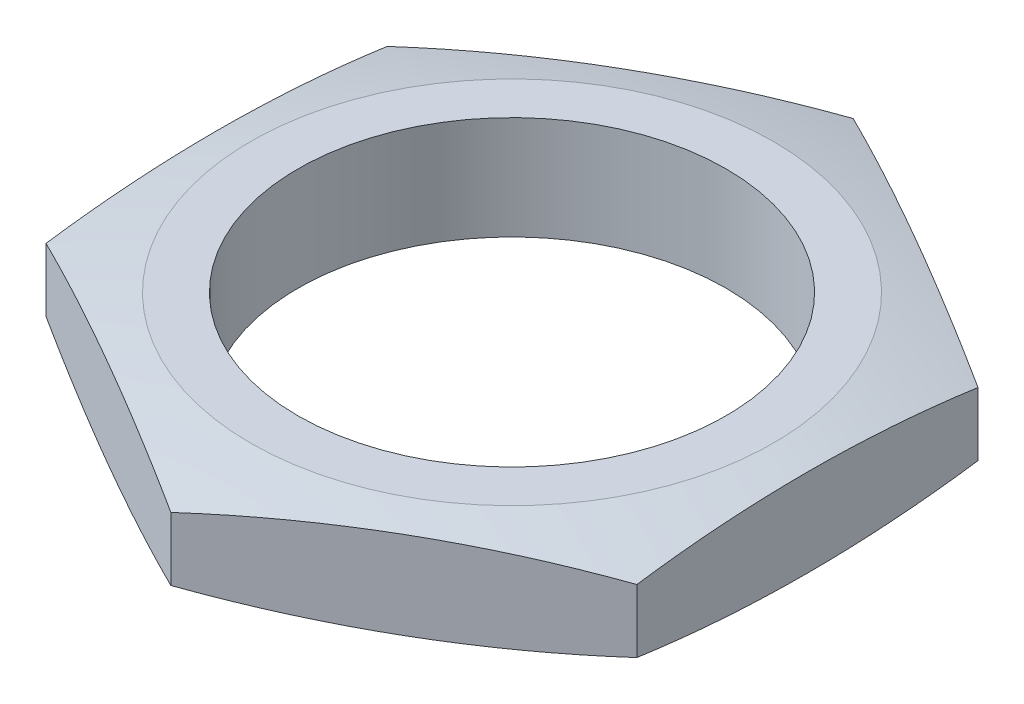
ISO-10303-21;
HEADER;
FILE_DESCRIPTION(('STEP AP214'),'2;1');
FILE_NAME('part.step','',(''),(''),'','','');
FILE_SCHEMA(('AUTOMOTIVE_DESIGN { 1 0 10303 214 1 1 1 1 }'));
ENDSEC;
DATA;
#1=APPLICATION_CONTEXT('core data for automotive mechanical design processes');
#2=APPLICATION_PROTOCOL_DEFINITION('international standard','automotive_design',2000,#1);
#3=PRODUCT_CONTEXT('',#1,'mechanical');
#4=PRODUCT('Part','Part','',(#3));
#5=PRODUCT_RELATED_PRODUCT_CATEGORY('part','',(#4));
#6=PRODUCT_DEFINITION_FORMATION('','',#4);
#7=PRODUCT_DEFINITION_CONTEXT('part definition',#1,'design');
#8=PRODUCT_DEFINITION('design','',#6,#7);
#9=PRODUCT_DEFINITION_SHAPE('','',#8);
#10=(LENGTH_UNIT() NAMED_UNIT(*) SI_UNIT(.MILLI.,.METRE.));
#11=(NAMED_UNIT(*) PLANE_ANGLE_UNIT() SI_UNIT($,.RADIAN.));
#12=(NAMED_UNIT(*) SI_UNIT($,.STERADIAN.) SOLID_ANGLE_UNIT());
#13=UNCERTAINTY_MEASURE_WITH_UNIT(LENGTH_MEASURE(1.E-05),#10,'distance_accuracy_value','');
#14=(GEOMETRIC_REPRESENTATION_CONTEXT(3) GLOBAL_UNCERTAINTY_ASSIGNED_CONTEXT((#13)) GLOBAL_UNIT_ASSIGNED_CONTEXT((#10,
#11,#12)) REPRESENTATION_CONTEXT('',''));
#15=CARTESIAN_POINT('',(0.,0.,0.));
#16=DIRECTION('',(0.,0.,1.));
#17=DIRECTION('',(1.,0.,0.));
#18=AXIS2_PLACEMENT_3D('',#15,#16,#17);
#19=CARTESIAN_POINT('',(0.,2.5,0.));
#20=DIRECTION('',(0.,1.,0.));
#21=DIRECTION('',(0.,0.,1.));
#22=AXIS2_PLACEMENT_3D('',#19,#20,#21);
#23=PLANE('',#22);
#24=CARTESIAN_POINT('',(0.,2.5,0.));
#25=DIRECTION('',(0.,1.,0.));
#26=DIRECTION('',(0.,0.,1.));
#27=AXIS2_PLACEMENT_3D('',#24,#25,#26);
#28=CIRCLE('',#27,6.31964714183581);
#29=CARTESIAN_POINT('',(0.,2.5,6.31964714183582));
#30=VERTEX_POINT('',#29);
#31=EDGE_CURVE('E96',#30,#30,#28,.F.);
#32=ORIENTED_EDGE('',*,*,#31,.F.);
#33=EDGE_LOOP('',(#32));
#34=FACE_BOUND('',#33,.T.);
#35=CARTESIAN_POINT('',(0.,2.5,0.));
#36=DIRECTION('',(0.,1.,0.));
#37=DIRECTION('',(0.,0.,1.));
#38=AXIS2_PLACEMENT_3D('',#35,#36,#37);
#39=CIRCLE('',#38,5.175);
#40=CARTESIAN_POINT('',(0.,2.5,5.175));
#41=VERTEX_POINT('',#40);
#42=EDGE_CURVE('E101',#41,#41,#39,.T.);
#43=ORIENTED_EDGE('',*,*,#42,.F.);
#44=EDGE_LOOP('',(#43));
#45=FACE_BOUND('',#44,.T.);
#46=ADVANCED_FACE('F33',(#34,#45),#23,.T.);
#47=CARTESIAN_POINT('',(0.,0.,0.));
#48=DIRECTION('',(0.,1.,0.));
#49=DIRECTION('',(0.,0.,1.));
#50=AXIS2_PLACEMENT_3D('',#47,#48,#49);
#51=PLANE('',#50);
#52=CARTESIAN_POINT('',(0.,0.,0.));
#53=DIRECTION('',(0.,1.,0.));
#54=DIRECTION('',(0.,0.,1.));
#55=AXIS2_PLACEMENT_3D('',#52,#53,#54);
#56=CIRCLE('',#55,6.31964714183581);
#57=CARTESIAN_POINT('',(0.,0.,6.31964714183582));
#58=VERTEX_POINT('',#57);
#59=EDGE_CURVE('E143',#58,#58,#56,.F.);
#60=ORIENTED_EDGE('',*,*,#59,.T.);
#61=EDGE_LOOP('',(#60));
#62=FACE_BOUND('',#61,.T.);
#63=CARTESIAN_POINT('',(0.,0.,0.));
#64=DIRECTION('',(0.,1.,0.));
#65=DIRECTION('',(0.,0.,1.));
#66=AXIS2_PLACEMENT_3D('',#63,#64,#65);
#67=CIRCLE('',#66,5.175);
#68=CARTESIAN_POINT('',(0.,0.,5.175));
#69=VERTEX_POINT('',#68);
#70=EDGE_CURVE('E106',#69,#69,#67,.T.);
#71=ORIENTED_EDGE('',*,*,#70,.T.);
#72=EDGE_LOOP('',(#71));
#73=FACE_BOUND('',#72,.T.);
#74=ADVANCED_FACE('F150',(#62,#73),#51,.F.);
#75=CARTESIAN_POINT('',(0.,2.5,0.));
#76=DIRECTION('',(0.,-1.,0.));
#77=DIRECTION('',(0.,0.,-1.));
#78=AXIS2_PLACEMENT_3D('',#75,#76,#77);
#79=CYLINDRICAL_SURFACE('',#78,5.175);
#80=ORIENTED_EDGE('',*,*,#42,.T.);
#81=EDGE_LOOP('',(#80));
#82=FACE_BOUND('',#81,.T.);
#83=ORIENTED_EDGE('',*,*,#70,.F.);
#84=EDGE_LOOP('',(#83));
#85=FACE_BOUND('',#84,.T.);
#86=ADVANCED_FACE('F152',(#82,#85),#79,.F.);
#87=CARTESIAN_POINT('',(0.,-26.7541818839251,0.));
#88=DIRECTION('',(0.,1.,0.));
#89=DIRECTION('',(-1.,0.,0.));
#90=AXIS2_PLACEMENT_3D('',#87,#88,#89);
#91=SPHERICAL_SURFACE('',#90,29.9290009471597);
#92=ORIENTED_EDGE('',*,*,#31,.T.);
#93=EDGE_LOOP('',(#92));
#94=FACE_BOUND('',#93,.T.);
#95=CARTESIAN_POINT('',(-3.5723547906108,-26.7541818839251,-6.18750000000001));
#96=DIRECTION('',(0.5,0.,0.866025403784439));
#97=DIRECTION('',(0.866025403784439,0.,-0.5));
#98=AXIS2_PLACEMENT_3D('',#95,#96,#97);
#99=CIRCLE('',#98,29.0636925165246);
#100=CARTESIAN_POINT('',(-7.14470958122161,2.01529148099913,-4.12500000000001));
#101=VERTEX_POINT('',#100);
#102=CARTESIAN_POINT('',(0.,2.01529148099914,-8.25));
#103=VERTEX_POINT('',#102);
#104=EDGE_CURVE('E97',#101,#103,#99,.F.);
#105=ORIENTED_EDGE('',*,*,#104,.F.);
#106=CARTESIAN_POINT('',(-7.14470958122161,-26.7541818839251,0.));
#107=DIRECTION('',(1.,0.,0.));
#108=DIRECTION('',(0.,0.,-1.));
#109=AXIS2_PLACEMENT_3D('',#106,#107,#108);
#110=CIRCLE('',#109,29.0636925165246);
#111=CARTESIAN_POINT('',(-7.14470958122161,2.01529148099914,4.125));
#112=VERTEX_POINT('',#111);
#113=EDGE_CURVE('E124',#112,#101,#110,.F.);
#114=ORIENTED_EDGE('',*,*,#113,.F.);
#115=CARTESIAN_POINT('',(-3.57235479061079,-26.7541818839251,6.1875));
#116=DIRECTION('',(0.5,0.,-0.866025403784439));
#117=DIRECTION('',(-0.866025403784439,0.,-0.5));
#118=AXIS2_PLACEMENT_3D('',#115,#116,#117);
#119=CIRCLE('',#118,29.0636925165246);
#120=CARTESIAN_POINT('',(0.,2.01529148099914,8.25));
#121=VERTEX_POINT('',#120);
#122=EDGE_CURVE('E126',#121,#112,#119,.F.);
#123=ORIENTED_EDGE('',*,*,#122,.F.);
#124=CARTESIAN_POINT('',(3.57235479061083,-26.7541818839251,6.1875));
#125=DIRECTION('',(-0.5,0.,-0.866025403784439));
#126=DIRECTION('',(-0.866025403784439,0.,0.5));
#127=AXIS2_PLACEMENT_3D('',#124,#125,#126);
#128=CIRCLE('',#127,29.0636925165246);
#129=CARTESIAN_POINT('',(7.14470958122161,2.01529148099914,4.12500000000001));
#130=VERTEX_POINT('',#129);
#131=EDGE_CURVE('E48',#130,#121,#128,.F.);
#132=ORIENTED_EDGE('',*,*,#131,.F.);
#133=CARTESIAN_POINT('',(7.1447095812216,-26.7541818839251,0.));
#134=DIRECTION('',(-1.,0.,0.));
#135=DIRECTION('',(0.,0.,1.));
#136=AXIS2_PLACEMENT_3D('',#133,#134,#135);
#137=CIRCLE('',#136,29.0636925165246);
#138=CARTESIAN_POINT('',(7.1447095812216,2.01529148099914,-4.12500000000001));
#139=VERTEX_POINT('',#138);
#140=EDGE_CURVE('E41',#139,#130,#137,.F.);
#141=ORIENTED_EDGE('',*,*,#140,.F.);
#142=CARTESIAN_POINT('',(3.57235479061082,-26.7541818839251,-6.1875));
#143=DIRECTION('',(-0.5,0.,0.866025403784439));
#144=DIRECTION('',(0.866025403784439,0.,0.5));
#145=AXIS2_PLACEMENT_3D('',#142,#143,#144);
#146=CIRCLE('',#145,29.0636925165246);
#147=EDGE_CURVE('E84',#103,#139,#146,.F.);
#148=ORIENTED_EDGE('',*,*,#147,.F.);
#149=EDGE_LOOP('',(#105,#114,#123,#132,#141,#148));
#150=FACE_BOUND('',#149,.T.);
#151=ADVANCED_FACE('F83',(#94,#150),#91,.T.);
#152=CARTESIAN_POINT('',(0.,29.2541818839251,0.));
#153=DIRECTION('',(0.,1.,0.));
#154=DIRECTION('',(-1.,0.,0.));
#155=AXIS2_PLACEMENT_3D('',#152,#153,#154);
#156=SPHERICAL_SURFACE('',#155,29.9290009471597);
#157=CARTESIAN_POINT('',(7.1447095812216,29.2541818839251,0.));
#158=DIRECTION('',(-1.,0.,0.));
#159=DIRECTION('',(0.,0.,1.));
#160=AXIS2_PLACEMENT_3D('',#157,#158,#159);
#161=CIRCLE('',#160,29.0636925165246);
#162=CARTESIAN_POINT('',(7.14470958122161,0.484708519000857,4.12500000000001));
#163=VERTEX_POINT('',#162);
#164=CARTESIAN_POINT('',(7.1447095812216,0.484708519000857,-4.12500000000001));
#165=VERTEX_POINT('',#164);
#166=EDGE_CURVE('E11',#163,#165,#161,.F.);
#167=ORIENTED_EDGE('',*,*,#166,.F.);
#168=CARTESIAN_POINT('',(3.57235479061083,29.2541818839251,6.1875));
#169=DIRECTION('',(-0.5,0.,-0.866025403784439));
#170=DIRECTION('',(-0.866025403784439,0.,0.5));
#171=AXIS2_PLACEMENT_3D('',#168,#169,#170);
#172=CIRCLE('',#171,29.0636925165246);
#173=CARTESIAN_POINT('',(0.,0.484708519000863,8.25));
#174=VERTEX_POINT('',#173);
#175=EDGE_CURVE('E132',#174,#163,#172,.F.);
#176=ORIENTED_EDGE('',*,*,#175,.F.);
#177=CARTESIAN_POINT('',(-3.57235479061079,29.2541818839251,6.1875));
#178=DIRECTION('',(0.5,0.,-0.866025403784439));
#179=DIRECTION('',(-0.866025403784439,0.,-0.5));
#180=AXIS2_PLACEMENT_3D('',#177,#178,#179);
#181=CIRCLE('',#180,29.0636925165246);
#182=CARTESIAN_POINT('',(-7.14470958122161,0.484708519000863,4.125));
#183=VERTEX_POINT('',#182);
#184=EDGE_CURVE('E135',#183,#174,#181,.F.);
#185=ORIENTED_EDGE('',*,*,#184,.F.);
#186=CARTESIAN_POINT('',(-7.14470958122161,29.2541818839251,0.));
#187=DIRECTION('',(1.,0.,0.));
#188=DIRECTION('',(0.,0.,-1.));
#189=AXIS2_PLACEMENT_3D('',#186,#187,#188);
#190=CIRCLE('',#189,29.0636925165246);
#191=CARTESIAN_POINT('',(-7.14470958122161,0.484708519000867,-4.12500000000001));
#192=VERTEX_POINT('',#191);
#193=EDGE_CURVE('E138',#192,#183,#190,.F.);
#194=ORIENTED_EDGE('',*,*,#193,.F.);
#195=CARTESIAN_POINT('',(-3.5723547906108,29.2541818839251,-6.18750000000001));
#196=DIRECTION('',(0.5,0.,0.866025403784439));
#197=DIRECTION('',(0.866025403784439,0.,-0.5));
#198=AXIS2_PLACEMENT_3D('',#195,#196,#197);
#199=CIRCLE('',#198,29.0636925165246);
#200=CARTESIAN_POINT('',(0.,0.484708519000863,-8.25));
#201=VERTEX_POINT('',#200);
#202=EDGE_CURVE('E122',#201,#192,#199,.F.);
#203=ORIENTED_EDGE('',*,*,#202,.F.);
#204=CARTESIAN_POINT('',(3.57235479061082,29.2541818839251,-6.1875));
#205=DIRECTION('',(-0.5,0.,0.866025403784439));
#206=DIRECTION('',(0.866025403784439,0.,0.5));
#207=AXIS2_PLACEMENT_3D('',#204,#205,#206);
#208=CIRCLE('',#207,29.0636925165246);
#209=EDGE_CURVE('E56',#165,#201,#208,.F.);
#210=ORIENTED_EDGE('',*,*,#209,.F.);
#211=EDGE_LOOP('',(#167,#176,#185,#194,#203,#210));
#212=FACE_BOUND('',#211,.T.);
#213=ORIENTED_EDGE('',*,*,#59,.F.);
#214=EDGE_LOOP('',(#213));
#215=FACE_BOUND('',#214,.T.);
#216=ADVANCED_FACE('F160',(#212,#215),#156,.T.);
#217=CARTESIAN_POINT('',(7.14470958122161,2.5,4.12500000000001));
#218=DIRECTION('',(-1.,0.,0.));
#219=DIRECTION('',(0.,0.,1.));
#220=AXIS2_PLACEMENT_3D('',#217,#218,#219);
#221=PLANE('',#220);
#222=DIRECTION('',(0.,-1.,0.));
#223=VECTOR('',#222,1.);
#224=CARTESIAN_POINT('',(7.14470958122161,2.5,4.12500000000001));
#225=LINE('',#224,#223);
#226=EDGE_CURVE('E100',#130,#163,#225,.T.);
#227=ORIENTED_EDGE('',*,*,#226,.T.);
#228=ORIENTED_EDGE('',*,*,#166,.T.);
#229=DIRECTION('',(0.,-1.,0.));
#230=VECTOR('',#229,1.);
#231=CARTESIAN_POINT('',(7.1447095812216,2.5,-4.12500000000001));
#232=LINE('',#231,#230);
#233=EDGE_CURVE('E94',#139,#165,#232,.T.);
#234=ORIENTED_EDGE('',*,*,#233,.F.);
#235=ORIENTED_EDGE('',*,*,#140,.T.);
#236=EDGE_LOOP('',(#227,#228,#234,#235));
#237=FACE_BOUND('',#236,.T.);
#238=ADVANCED_FACE('F99',(#237),#221,.F.);
#239=CARTESIAN_POINT('',(0.,2.5,8.25));
#240=DIRECTION('',(-0.5,0.,-0.866025403784439));
#241=DIRECTION('',(-0.866025403784439,0.,0.5));
#242=AXIS2_PLACEMENT_3D('',#239,#240,#241);
#243=PLANE('',#242);
#244=DIRECTION('',(0.,-1.,0.));
#245=VECTOR('',#244,1.);
#246=CARTESIAN_POINT('',(0.,2.5,8.25));
#247=LINE('',#246,#245);
#248=EDGE_CURVE('E103',#121,#174,#247,.T.);
#249=ORIENTED_EDGE('',*,*,#248,.T.);
#250=ORIENTED_EDGE('',*,*,#175,.T.);
#251=ORIENTED_EDGE('',*,*,#226,.F.);
#252=ORIENTED_EDGE('',*,*,#131,.T.);
#253=EDGE_LOOP('',(#249,#250,#251,#252));
#254=FACE_BOUND('',#253,.T.);
#255=ADVANCED_FACE('F175',(#254),#243,.F.);
#256=CARTESIAN_POINT('',(-7.14470958122161,2.5,4.125));
#257=DIRECTION('',(0.5,0.,-0.866025403784439));
#258=DIRECTION('',(-0.866025403784439,0.,-0.5));
#259=AXIS2_PLACEMENT_3D('',#256,#257,#258);
#260=PLANE('',#259);
#261=DIRECTION('',(0.,-1.,0.));
#262=VECTOR('',#261,1.);
#263=CARTESIAN_POINT('',(-7.14470958122161,2.5,4.125));
#264=LINE('',#263,#262);
#265=EDGE_CURVE('E112',#112,#183,#264,.T.);
#266=ORIENTED_EDGE('',*,*,#265,.T.);
#267=ORIENTED_EDGE('',*,*,#184,.T.);
#268=ORIENTED_EDGE('',*,*,#248,.F.);
#269=ORIENTED_EDGE('',*,*,#122,.T.);
#270=EDGE_LOOP('',(#266,#267,#268,#269));
#271=FACE_BOUND('',#270,.T.);
#272=ADVANCED_FACE('F178',(#271),#260,.F.);
#273=CARTESIAN_POINT('',(-7.14470958122161,2.5,-4.12500000000001));
#274=DIRECTION('',(1.,0.,0.));
#275=DIRECTION('',(0.,0.,-1.));
#276=AXIS2_PLACEMENT_3D('',#273,#274,#275);
#277=PLANE('',#276);
#278=DIRECTION('',(0.,-1.,0.));
#279=VECTOR('',#278,1.);
#280=CARTESIAN_POINT('',(-7.14470958122161,2.5,-4.12500000000001));
#281=LINE('',#280,#279);
#282=EDGE_CURVE('E115',#101,#192,#281,.T.);
#283=ORIENTED_EDGE('',*,*,#282,.T.);
#284=ORIENTED_EDGE('',*,*,#193,.T.);
#285=ORIENTED_EDGE('',*,*,#265,.F.);
#286=ORIENTED_EDGE('',*,*,#113,.T.);
#287=EDGE_LOOP('',(#283,#284,#285,#286));
#288=FACE_BOUND('',#287,.T.);
#289=ADVANCED_FACE('F182',(#288),#277,.F.);
#290=CARTESIAN_POINT('',(0.,2.5,-8.25));
#291=DIRECTION('',(0.5,0.,0.866025403784439));
#292=DIRECTION('',(0.866025403784439,0.,-0.5));
#293=AXIS2_PLACEMENT_3D('',#290,#291,#292);
#294=PLANE('',#293);
#295=DIRECTION('',(0.,-1.,0.));
#296=VECTOR('',#295,1.);
#297=CARTESIAN_POINT('',(0.,2.5,-8.25));
#298=LINE('',#297,#296);
#299=EDGE_CURVE('E90',#103,#201,#298,.T.);
#300=ORIENTED_EDGE('',*,*,#299,.T.);
#301=ORIENTED_EDGE('',*,*,#202,.T.);
#302=ORIENTED_EDGE('',*,*,#282,.F.);
#303=ORIENTED_EDGE('',*,*,#104,.T.);
#304=EDGE_LOOP('',(#300,#301,#302,#303));
#305=FACE_BOUND('',#304,.T.);
#306=ADVANCED_FACE('F120',(#305),#294,.F.);
#307=CARTESIAN_POINT('',(7.1447095812216,2.5,-4.12500000000001));
#308=DIRECTION('',(-0.5,0.,0.866025403784439));
#309=DIRECTION('',(0.866025403784439,0.,0.5));
#310=AXIS2_PLACEMENT_3D('',#307,#308,#309);
#311=PLANE('',#310);
#312=ORIENTED_EDGE('',*,*,#233,.T.);
#313=ORIENTED_EDGE('',*,*,#209,.T.);
#314=ORIENTED_EDGE('',*,*,#299,.F.);
#315=ORIENTED_EDGE('',*,*,#147,.T.);
#316=EDGE_LOOP('',(#312,#313,#314,#315));
#317=FACE_BOUND('',#316,.T.);
#318=ADVANCED_FACE('F35',(#317),#311,.F.);
#319=CLOSED_SHELL('',(#46,#74,#86,#151,#216,#238,#255,#272,#289,#306,#318));
#320=MANIFOLD_SOLID_BREP('B2',#319);
#321=ADVANCED_BREP_SHAPE_REPRESENTATION('',(#18,#320),#14);
#322=SHAPE_DEFINITION_REPRESENTATION(#9,#321);
ENDSEC;
END-ISO-10303-21;
